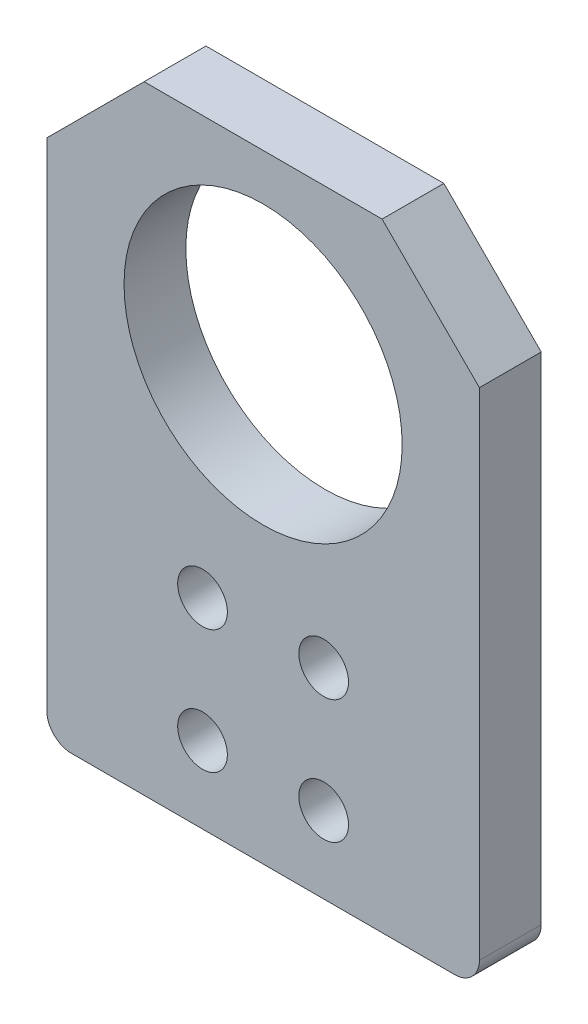
ISO-10303-21;
HEADER;
FILE_DESCRIPTION(('STEP AP214'),'2;1');
FILE_NAME('part.step','',(''),(''),'','','');
FILE_SCHEMA(('AUTOMOTIVE_DESIGN { 1 0 10303 214 1 1 1 1 }'));
ENDSEC;
DATA;
#1=APPLICATION_CONTEXT('core data for automotive mechanical design processes');
#2=APPLICATION_PROTOCOL_DEFINITION('international standard','automotive_design',2000,#1);
#3=PRODUCT_CONTEXT('',#1,'mechanical');
#4=PRODUCT('Part','Part','',(#3));
#5=PRODUCT_RELATED_PRODUCT_CATEGORY('part','',(#4));
#6=PRODUCT_DEFINITION_FORMATION('','',#4);
#7=PRODUCT_DEFINITION_CONTEXT('part definition',#1,'design');
#8=PRODUCT_DEFINITION('design','',#6,#7);
#9=PRODUCT_DEFINITION_SHAPE('','',#8);
#10=(LENGTH_UNIT() NAMED_UNIT(*) SI_UNIT(.MILLI.,.METRE.));
#11=(NAMED_UNIT(*) PLANE_ANGLE_UNIT() SI_UNIT($,.RADIAN.));
#12=(NAMED_UNIT(*) SI_UNIT($,.STERADIAN.) SOLID_ANGLE_UNIT());
#13=UNCERTAINTY_MEASURE_WITH_UNIT(LENGTH_MEASURE(1.E-05),#10,'distance_accuracy_value','');
#14=(GEOMETRIC_REPRESENTATION_CONTEXT(3) GLOBAL_UNCERTAINTY_ASSIGNED_CONTEXT((#13)) GLOBAL_UNIT_ASSIGNED_CONTEXT((#10,
#11,#12)) REPRESENTATION_CONTEXT('',''));
#15=CARTESIAN_POINT('',(0.,0.,0.));
#16=DIRECTION('',(0.,0.,1.));
#17=DIRECTION('',(1.,0.,0.));
#18=AXIS2_PLACEMENT_3D('',#15,#16,#17);
#19=CARTESIAN_POINT('',(22.225,-31.75,3.175));
#20=DIRECTION('',(-1.,0.,0.));
#21=DIRECTION('',(0.,0.,1.));
#22=AXIS2_PLACEMENT_3D('',#19,#20,#21);
#23=PLANE('',#22);
#24=DIRECTION('',(0.,1.,0.));
#25=VECTOR('',#24,1.);
#26=CARTESIAN_POINT('',(22.225,-31.75,3.175));
#27=LINE('',#26,#25);
#28=CARTESIAN_POINT('',(22.225,-29.21,3.175));
#29=VERTEX_POINT('',#28);
#30=CARTESIAN_POINT('',(22.225,21.75,3.175));
#31=VERTEX_POINT('',#30);
#32=EDGE_CURVE('E136',#29,#31,#27,.T.);
#33=ORIENTED_EDGE('',*,*,#32,.F.);
#34=DIRECTION('',(0.,0.,-1.));
#35=VECTOR('',#34,1.);
#36=CARTESIAN_POINT('',(22.225,-29.21,3.175));
#37=LINE('',#36,#35);
#38=CARTESIAN_POINT('',(22.225,-29.21,-3.175));
#39=VERTEX_POINT('',#38);
#40=EDGE_CURVE('E173',#29,#39,#37,.T.);
#41=ORIENTED_EDGE('',*,*,#40,.T.);
#42=DIRECTION('',(0.,1.,0.));
#43=VECTOR('',#42,1.);
#44=CARTESIAN_POINT('',(22.225,-31.75,-3.175));
#45=LINE('',#44,#43);
#46=CARTESIAN_POINT('',(22.225,21.75,-3.175));
#47=VERTEX_POINT('',#46);
#48=EDGE_CURVE('E133',#39,#47,#45,.T.);
#49=ORIENTED_EDGE('',*,*,#48,.T.);
#50=DIRECTION('',(0.,0.,1.));
#51=VECTOR('',#50,1.);
#52=CARTESIAN_POINT('',(22.225,21.75,3.175));
#53=LINE('',#52,#51);
#54=EDGE_CURVE('E163',#47,#31,#53,.T.);
#55=ORIENTED_EDGE('',*,*,#54,.T.);
#56=EDGE_LOOP('',(#33,#41,#49,#55));
#57=FACE_BOUND('',#56,.T.);
#58=ADVANCED_FACE('F35',(#57),#23,.F.);
#59=CARTESIAN_POINT('',(-22.225,31.75,3.175));
#60=DIRECTION('',(0.,-1.,0.));
#61=DIRECTION('',(0.,0.,-1.));
#62=AXIS2_PLACEMENT_3D('',#59,#60,#61);
#63=PLANE('',#62);
#64=DIRECTION('',(-1.,0.,0.));
#65=VECTOR('',#64,1.);
#66=CARTESIAN_POINT('',(-22.225,31.75,3.175));
#67=LINE('',#66,#65);
#68=CARTESIAN_POINT('',(12.225,31.75,3.175));
#69=VERTEX_POINT('',#68);
#70=CARTESIAN_POINT('',(-12.225,31.75,3.175));
#71=VERTEX_POINT('',#70);
#72=EDGE_CURVE('E138',#69,#71,#67,.T.);
#73=ORIENTED_EDGE('',*,*,#72,.F.);
#74=DIRECTION('',(0.,0.,-1.));
#75=VECTOR('',#74,1.);
#76=CARTESIAN_POINT('',(12.225,31.75,3.175));
#77=LINE('',#76,#75);
#78=CARTESIAN_POINT('',(12.225,31.75,-3.175));
#79=VERTEX_POINT('',#78);
#80=EDGE_CURVE('E155',#69,#79,#77,.T.);
#81=ORIENTED_EDGE('',*,*,#80,.T.);
#82=DIRECTION('',(-1.,0.,0.));
#83=VECTOR('',#82,1.);
#84=CARTESIAN_POINT('',(-22.225,31.75,-3.175));
#85=LINE('',#84,#83);
#86=CARTESIAN_POINT('',(-12.225,31.75,-3.175));
#87=VERTEX_POINT('',#86);
#88=EDGE_CURVE('E148',#79,#87,#85,.T.);
#89=ORIENTED_EDGE('',*,*,#88,.T.);
#90=DIRECTION('',(0.,0.,1.));
#91=VECTOR('',#90,1.);
#92=CARTESIAN_POINT('',(-12.225,31.75,3.175));
#93=LINE('',#92,#91);
#94=EDGE_CURVE('E146',#87,#71,#93,.T.);
#95=ORIENTED_EDGE('',*,*,#94,.T.);
#96=EDGE_LOOP('',(#73,#81,#89,#95));
#97=FACE_BOUND('',#96,.T.);
#98=ADVANCED_FACE('F225',(#97),#63,.F.);
#99=CARTESIAN_POINT('',(-22.225,-31.75,3.175));
#100=DIRECTION('',(1.,0.,0.));
#101=DIRECTION('',(0.,0.,-1.));
#102=AXIS2_PLACEMENT_3D('',#99,#100,#101);
#103=PLANE('',#102);
#104=DIRECTION('',(0.,-1.,0.));
#105=VECTOR('',#104,1.);
#106=CARTESIAN_POINT('',(-22.225,-31.75,-3.175));
#107=LINE('',#106,#105);
#108=CARTESIAN_POINT('',(-22.225,21.75,-3.175));
#109=VERTEX_POINT('',#108);
#110=CARTESIAN_POINT('',(-22.225,-29.21,-3.175));
#111=VERTEX_POINT('',#110);
#112=EDGE_CURVE('E151',#109,#111,#107,.T.);
#113=ORIENTED_EDGE('',*,*,#112,.T.);
#114=DIRECTION('',(0.,0.,-1.));
#115=VECTOR('',#114,1.);
#116=CARTESIAN_POINT('',(-22.225,-29.21,3.175));
#117=LINE('',#116,#115);
#118=CARTESIAN_POINT('',(-22.225,-29.21,3.175));
#119=VERTEX_POINT('',#118);
#120=EDGE_CURVE('E11',#111,#119,#117,.F.);
#121=ORIENTED_EDGE('',*,*,#120,.T.);
#122=DIRECTION('',(0.,-1.,0.));
#123=VECTOR('',#122,1.);
#124=CARTESIAN_POINT('',(-22.225,-31.75,3.175));
#125=LINE('',#124,#123);
#126=CARTESIAN_POINT('',(-22.225,21.75,3.175));
#127=VERTEX_POINT('',#126);
#128=EDGE_CURVE('E142',#127,#119,#125,.T.);
#129=ORIENTED_EDGE('',*,*,#128,.F.);
#130=DIRECTION('',(0.,0.,-1.));
#131=VECTOR('',#130,1.);
#132=CARTESIAN_POINT('',(-22.225,21.75,3.175));
#133=LINE('',#132,#131);
#134=EDGE_CURVE('E170',#127,#109,#133,.T.);
#135=ORIENTED_EDGE('',*,*,#134,.T.);
#136=EDGE_LOOP('',(#113,#121,#129,#135));
#137=FACE_BOUND('',#136,.T.);
#138=ADVANCED_FACE('F216',(#137),#103,.F.);
#139=CARTESIAN_POINT('',(-22.225,-31.75,3.175));
#140=DIRECTION('',(0.,1.,0.));
#141=DIRECTION('',(0.,0.,1.));
#142=AXIS2_PLACEMENT_3D('',#139,#140,#141);
#143=PLANE('',#142);
#144=CARTESIAN_POINT('',(-15.875,-31.75,0.));
#145=DIRECTION('',(0.,-1.,0.));
#146=DIRECTION('',(0.,0.,-1.));
#147=AXIS2_PLACEMENT_3D('',#144,#145,#146);
#148=CIRCLE('',#147,1.89864999999999);
#149=CARTESIAN_POINT('',(-15.875,-31.75,-1.89865));
#150=VERTEX_POINT('',#149);
#151=EDGE_CURVE('E117',#150,#150,#148,.T.);
#152=ORIENTED_EDGE('',*,*,#151,.F.);
#153=EDGE_LOOP('',(#152));
#154=FACE_BOUND('',#153,.T.);
#155=CARTESIAN_POINT('',(15.875,-31.75,0.));
#156=DIRECTION('',(0.,-1.,0.));
#157=DIRECTION('',(0.,0.,-1.));
#158=AXIS2_PLACEMENT_3D('',#155,#156,#157);
#159=CIRCLE('',#158,1.89864999999999);
#160=CARTESIAN_POINT('',(15.875,-31.75,-1.89864999999999));
#161=VERTEX_POINT('',#160);
#162=EDGE_CURVE('E116',#161,#161,#159,.T.);
#163=ORIENTED_EDGE('',*,*,#162,.F.);
#164=EDGE_LOOP('',(#163));
#165=FACE_BOUND('',#164,.T.);
#166=DIRECTION('',(1.,0.,0.));
#167=VECTOR('',#166,1.);
#168=CARTESIAN_POINT('',(-22.225,-31.75,-3.175));
#169=LINE('',#168,#167);
#170=CARTESIAN_POINT('',(-19.685,-31.75,-3.175));
#171=VERTEX_POINT('',#170);
#172=CARTESIAN_POINT('',(19.685,-31.75,-3.175));
#173=VERTEX_POINT('',#172);
#174=EDGE_CURVE('E139',#171,#173,#169,.T.);
#175=ORIENTED_EDGE('',*,*,#174,.T.);
#176=DIRECTION('',(0.,0.,-1.));
#177=VECTOR('',#176,1.);
#178=CARTESIAN_POINT('',(19.685,-31.75,3.175));
#179=LINE('',#178,#177);
#180=CARTESIAN_POINT('',(19.685,-31.75,3.175));
#181=VERTEX_POINT('',#180);
#182=EDGE_CURVE('E56',#173,#181,#179,.F.);
#183=ORIENTED_EDGE('',*,*,#182,.T.);
#184=DIRECTION('',(1.,0.,0.));
#185=VECTOR('',#184,1.);
#186=CARTESIAN_POINT('',(-22.225,-31.75,3.175));
#187=LINE('',#186,#185);
#188=CARTESIAN_POINT('',(-19.685,-31.75,3.175));
#189=VERTEX_POINT('',#188);
#190=EDGE_CURVE('E144',#189,#181,#187,.T.);
#191=ORIENTED_EDGE('',*,*,#190,.F.);
#192=DIRECTION('',(0.,0.,-1.));
#193=VECTOR('',#192,1.);
#194=CARTESIAN_POINT('',(-19.685,-31.75,3.175));
#195=LINE('',#194,#193);
#196=EDGE_CURVE('E192',#189,#171,#195,.T.);
#197=ORIENTED_EDGE('',*,*,#196,.T.);
#198=EDGE_LOOP('',(#175,#183,#191,#197));
#199=FACE_BOUND('',#198,.T.);
#200=ADVANCED_FACE('F211',(#154,#165,#199),#143,.F.);
#201=CARTESIAN_POINT('',(0.,0.,3.175));
#202=DIRECTION('',(0.,0.,-1.));
#203=DIRECTION('',(-1.,0.,0.));
#204=AXIS2_PLACEMENT_3D('',#201,#202,#203);
#205=PLANE('',#204);
#206=CARTESIAN_POINT('',(-6.223,-11.176,3.175));
#207=DIRECTION('',(0.,0.,1.));
#208=DIRECTION('',(1.,0.,0.));
#209=AXIS2_PLACEMENT_3D('',#206,#207,#208);
#210=CIRCLE('',#209,2.55269999999999);
#211=CARTESIAN_POINT('',(-3.67030000000001,-11.176,3.175));
#212=VERTEX_POINT('',#211);
#213=EDGE_CURVE('E185',#212,#212,#210,.T.);
#214=ORIENTED_EDGE('',*,*,#213,.F.);
#215=EDGE_LOOP('',(#214));
#216=FACE_BOUND('',#215,.T.);
#217=CARTESIAN_POINT('',(6.223,-11.176,3.175));
#218=DIRECTION('',(0.,0.,1.));
#219=DIRECTION('',(1.,0.,0.));
#220=AXIS2_PLACEMENT_3D('',#217,#218,#219);
#221=CIRCLE('',#220,2.55269999999999);
#222=CARTESIAN_POINT('',(8.77569999999999,-11.176,3.175));
#223=VERTEX_POINT('',#222);
#224=EDGE_CURVE('E181',#223,#223,#221,.T.);
#225=ORIENTED_EDGE('',*,*,#224,.F.);
#226=EDGE_LOOP('',(#225));
#227=FACE_BOUND('',#226,.T.);
#228=CARTESIAN_POINT('',(6.223,-23.876,3.175));
#229=DIRECTION('',(0.,0.,1.));
#230=DIRECTION('',(1.,0.,0.));
#231=AXIS2_PLACEMENT_3D('',#228,#229,#230);
#232=CIRCLE('',#231,2.55269999999999);
#233=CARTESIAN_POINT('',(8.77569999999999,-23.876,3.175));
#234=VERTEX_POINT('',#233);
#235=EDGE_CURVE('E180',#234,#234,#232,.T.);
#236=ORIENTED_EDGE('',*,*,#235,.F.);
#237=EDGE_LOOP('',(#236));
#238=FACE_BOUND('',#237,.T.);
#239=CARTESIAN_POINT('',(-6.223,-23.876,3.175));
#240=DIRECTION('',(0.,0.,1.));
#241=DIRECTION('',(1.,0.,0.));
#242=AXIS2_PLACEMENT_3D('',#239,#240,#241);
#243=CIRCLE('',#242,2.55269999999999);
#244=CARTESIAN_POINT('',(-3.67030000000001,-23.876,3.175));
#245=VERTEX_POINT('',#244);
#246=EDGE_CURVE('E176',#245,#245,#243,.T.);
#247=ORIENTED_EDGE('',*,*,#246,.F.);
#248=EDGE_LOOP('',(#247));
#249=FACE_BOUND('',#248,.T.);
#250=CARTESIAN_POINT('',(0.,12.7,3.175));
#251=DIRECTION('',(0.,0.,1.));
#252=DIRECTION('',(1.,0.,0.));
#253=AXIS2_PLACEMENT_3D('',#250,#251,#252);
#254=CIRCLE('',#253,14.2875);
#255=CARTESIAN_POINT('',(14.2875,12.7,3.175));
#256=VERTEX_POINT('',#255);
#257=EDGE_CURVE('E129',#256,#256,#254,.T.);
#258=ORIENTED_EDGE('',*,*,#257,.F.);
#259=EDGE_LOOP('',(#258));
#260=FACE_BOUND('',#259,.T.);
#261=ORIENTED_EDGE('',*,*,#190,.T.);
#262=CARTESIAN_POINT('',(19.685,-29.21,3.175));
#263=DIRECTION('',(0.,0.,-1.));
#264=DIRECTION('',(-1.,0.,0.));
#265=AXIS2_PLACEMENT_3D('',#262,#263,#264);
#266=CIRCLE('',#265,2.54);
#267=EDGE_CURVE('E43',#181,#29,#266,.F.);
#268=ORIENTED_EDGE('',*,*,#267,.T.);
#269=ORIENTED_EDGE('',*,*,#32,.T.);
#270=DIRECTION('',(0.707106781186546,-0.707106781186549,0.));
#271=VECTOR('',#270,1.);
#272=CARTESIAN_POINT('',(12.225,31.75,3.175));
#273=LINE('',#272,#271);
#274=EDGE_CURVE('E168',#31,#69,#273,.F.);
#275=ORIENTED_EDGE('',*,*,#274,.T.);
#276=ORIENTED_EDGE('',*,*,#72,.T.);
#277=DIRECTION('',(0.707106781186549,0.707106781186546,0.));
#278=VECTOR('',#277,1.);
#279=CARTESIAN_POINT('',(-22.225,21.75,3.175));
#280=LINE('',#279,#278);
#281=EDGE_CURVE('E166',#71,#127,#280,.F.);
#282=ORIENTED_EDGE('',*,*,#281,.T.);
#283=ORIENTED_EDGE('',*,*,#128,.T.);
#284=CARTESIAN_POINT('',(-19.685,-29.21,3.175));
#285=DIRECTION('',(0.,0.,-1.));
#286=DIRECTION('',(-1.,0.,0.));
#287=AXIS2_PLACEMENT_3D('',#284,#285,#286);
#288=CIRCLE('',#287,2.54);
#289=EDGE_CURVE('E196',#119,#189,#288,.F.);
#290=ORIENTED_EDGE('',*,*,#289,.T.);
#291=EDGE_LOOP('',(#261,#268,#269,#275,#276,#282,#283,#290));
#292=FACE_BOUND('',#291,.T.);
#293=ADVANCED_FACE('F200',(#216,#227,#238,#249,#260,#292),#205,.F.);
#294=CARTESIAN_POINT('',(0.,0.,-3.175));
#295=DIRECTION('',(0.,0.,-1.));
#296=DIRECTION('',(-1.,0.,0.));
#297=AXIS2_PLACEMENT_3D('',#294,#295,#296);
#298=PLANE('',#297);
#299=CARTESIAN_POINT('',(-6.223,-11.176,-3.175));
#300=DIRECTION('',(0.,0.,-1.));
#301=DIRECTION('',(-1.,0.,0.));
#302=AXIS2_PLACEMENT_3D('',#299,#300,#301);
#303=CIRCLE('',#302,2.55269999999999);
#304=CARTESIAN_POINT('',(-8.77569999999999,-11.176,-3.175));
#305=VERTEX_POINT('',#304);
#306=EDGE_CURVE('E182',#305,#305,#303,.T.);
#307=ORIENTED_EDGE('',*,*,#306,.F.);
#308=EDGE_LOOP('',(#307));
#309=FACE_BOUND('',#308,.T.);
#310=CARTESIAN_POINT('',(6.223,-11.176,-3.175));
#311=DIRECTION('',(0.,0.,-1.));
#312=DIRECTION('',(-1.,0.,0.));
#313=AXIS2_PLACEMENT_3D('',#310,#311,#312);
#314=CIRCLE('',#313,2.55269999999999);
#315=CARTESIAN_POINT('',(3.67030000000001,-11.176,-3.175));
#316=VERTEX_POINT('',#315);
#317=EDGE_CURVE('E177',#316,#316,#314,.T.);
#318=ORIENTED_EDGE('',*,*,#317,.F.);
#319=EDGE_LOOP('',(#318));
#320=FACE_BOUND('',#319,.T.);
#321=CARTESIAN_POINT('',(6.223,-23.876,-3.175));
#322=DIRECTION('',(0.,0.,-1.));
#323=DIRECTION('',(-1.,0.,0.));
#324=AXIS2_PLACEMENT_3D('',#321,#322,#323);
#325=CIRCLE('',#324,2.55269999999999);
#326=CARTESIAN_POINT('',(3.67030000000001,-23.876,-3.175));
#327=VERTEX_POINT('',#326);
#328=EDGE_CURVE('E296',#327,#327,#325,.T.);
#329=ORIENTED_EDGE('',*,*,#328,.F.);
#330=EDGE_LOOP('',(#329));
#331=FACE_BOUND('',#330,.T.);
#332=CARTESIAN_POINT('',(-6.223,-23.876,-3.175));
#333=DIRECTION('',(0.,0.,-1.));
#334=DIRECTION('',(-1.,0.,0.));
#335=AXIS2_PLACEMENT_3D('',#332,#333,#334);
#336=CIRCLE('',#335,2.55269999999999);
#337=CARTESIAN_POINT('',(-8.77569999999999,-23.876,-3.175));
#338=VERTEX_POINT('',#337);
#339=EDGE_CURVE('E123',#338,#338,#336,.T.);
#340=ORIENTED_EDGE('',*,*,#339,.F.);
#341=EDGE_LOOP('',(#340));
#342=FACE_BOUND('',#341,.T.);
#343=CARTESIAN_POINT('',(0.,12.7,-3.175));
#344=DIRECTION('',(0.,0.,1.));
#345=DIRECTION('',(1.,0.,0.));
#346=AXIS2_PLACEMENT_3D('',#343,#344,#345);
#347=CIRCLE('',#346,14.2875);
#348=CARTESIAN_POINT('',(14.2875,12.7,-3.175));
#349=VERTEX_POINT('',#348);
#350=EDGE_CURVE('E130',#349,#349,#347,.T.);
#351=ORIENTED_EDGE('',*,*,#350,.T.);
#352=EDGE_LOOP('',(#351));
#353=FACE_BOUND('',#352,.T.);
#354=ORIENTED_EDGE('',*,*,#48,.F.);
#355=CARTESIAN_POINT('',(19.685,-29.21,-3.175));
#356=DIRECTION('',(0.,0.,-1.));
#357=DIRECTION('',(-1.,0.,0.));
#358=AXIS2_PLACEMENT_3D('',#355,#356,#357);
#359=CIRCLE('',#358,2.54);
#360=EDGE_CURVE('E190',#39,#173,#359,.T.);
#361=ORIENTED_EDGE('',*,*,#360,.T.);
#362=ORIENTED_EDGE('',*,*,#174,.F.);
#363=CARTESIAN_POINT('',(-19.685,-29.21,-3.175));
#364=DIRECTION('',(0.,0.,-1.));
#365=DIRECTION('',(-1.,0.,0.));
#366=AXIS2_PLACEMENT_3D('',#363,#364,#365);
#367=CIRCLE('',#366,2.54);
#368=EDGE_CURVE('E188',#171,#111,#367,.T.);
#369=ORIENTED_EDGE('',*,*,#368,.T.);
#370=ORIENTED_EDGE('',*,*,#112,.F.);
#371=DIRECTION('',(-0.707106781186549,-0.707106781186546,0.));
#372=VECTOR('',#371,1.);
#373=CARTESIAN_POINT('',(-21.9875,21.9875000000001,-3.175));
#374=LINE('',#373,#372);
#375=EDGE_CURVE('E158',#109,#87,#374,.F.);
#376=ORIENTED_EDGE('',*,*,#375,.T.);
#377=ORIENTED_EDGE('',*,*,#88,.F.);
#378=DIRECTION('',(-0.707106781186546,0.707106781186549,0.));
#379=VECTOR('',#378,1.);
#380=CARTESIAN_POINT('',(21.9875,21.9875,-3.175));
#381=LINE('',#380,#379);
#382=EDGE_CURVE('E160',#79,#47,#381,.F.);
#383=ORIENTED_EDGE('',*,*,#382,.T.);
#384=EDGE_LOOP('',(#354,#361,#362,#369,#370,#376,#377,#383));
#385=FACE_BOUND('',#384,.T.);
#386=ADVANCED_FACE('F210',(#309,#320,#331,#342,#353,#385),#298,.T.);
#387=CARTESIAN_POINT('',(12.225,31.75,3.175));
#388=DIRECTION('',(-0.707106781186549,-0.707106781186546,0.));
#389=DIRECTION('',(0.,0.,-1.));
#390=AXIS2_PLACEMENT_3D('',#387,#388,#389);
#391=PLANE('',#390);
#392=ORIENTED_EDGE('',*,*,#274,.F.);
#393=ORIENTED_EDGE('',*,*,#54,.F.);
#394=ORIENTED_EDGE('',*,*,#382,.F.);
#395=ORIENTED_EDGE('',*,*,#80,.F.);
#396=EDGE_LOOP('',(#392,#393,#394,#395));
#397=FACE_BOUND('',#396,.T.);
#398=ADVANCED_FACE('F228',(#397),#391,.F.);
#399=CARTESIAN_POINT('',(-22.225,21.75,3.175));
#400=DIRECTION('',(0.707106781186546,-0.707106781186549,0.));
#401=DIRECTION('',(0.,0.,-1.));
#402=AXIS2_PLACEMENT_3D('',#399,#400,#401);
#403=PLANE('',#402);
#404=ORIENTED_EDGE('',*,*,#281,.F.);
#405=ORIENTED_EDGE('',*,*,#94,.F.);
#406=ORIENTED_EDGE('',*,*,#375,.F.);
#407=ORIENTED_EDGE('',*,*,#134,.F.);
#408=EDGE_LOOP('',(#404,#405,#406,#407));
#409=FACE_BOUND('',#408,.T.);
#410=ADVANCED_FACE('F220',(#409),#403,.F.);
#411=CARTESIAN_POINT('',(0.,12.7,-3.175));
#412=DIRECTION('',(0.,0.,1.));
#413=DIRECTION('',(1.,0.,0.));
#414=AXIS2_PLACEMENT_3D('',#411,#412,#413);
#415=CYLINDRICAL_SURFACE('',#414,14.2875);
#416=ORIENTED_EDGE('',*,*,#350,.F.);
#417=EDGE_LOOP('',(#416));
#418=FACE_BOUND('',#417,.T.);
#419=ORIENTED_EDGE('',*,*,#257,.T.);
#420=EDGE_LOOP('',(#419));
#421=FACE_BOUND('',#420,.T.);
#422=ADVANCED_FACE('F235',(#418,#421),#415,.F.);
#423=CARTESIAN_POINT('',(15.875,-12.7,0.));
#424=DIRECTION('',(0.,-1.,0.));
#425=DIRECTION('',(0.,0.,-1.));
#426=AXIS2_PLACEMENT_3D('',#423,#424,#425);
#427=CONICAL_SURFACE('',#426,1.89864999999999,1.02974425867665);
#428=CARTESIAN_POINT('',(15.875,-11.5591759856833,0.));
#429=VERTEX_POINT('',#428);
#430=VERTEX_LOOP('',#429);
#431=FACE_BOUND('',#430,.T.);
#432=CARTESIAN_POINT('',(15.875,-12.7,0.));
#433=DIRECTION('',(0.,-1.,0.));
#434=DIRECTION('',(0.,0.,-1.));
#435=AXIS2_PLACEMENT_3D('',#432,#433,#434);
#436=CIRCLE('',#435,1.89864999999999);
#437=CARTESIAN_POINT('',(15.875,-12.7,-1.89864999999999));
#438=VERTEX_POINT('',#437);
#439=EDGE_CURVE('E120',#438,#438,#436,.T.);
#440=ORIENTED_EDGE('',*,*,#439,.T.);
#441=EDGE_LOOP('',(#440));
#442=FACE_BOUND('',#441,.T.);
#443=ADVANCED_FACE('F259',(#431,#442),#427,.F.);
#444=CARTESIAN_POINT('',(15.875,-31.75,0.));
#445=DIRECTION('',(0.,-1.,0.));
#446=DIRECTION('',(0.,0.,-1.));
#447=AXIS2_PLACEMENT_3D('',#444,#445,#446);
#448=CYLINDRICAL_SURFACE('',#447,1.89864999999999);
#449=ORIENTED_EDGE('',*,*,#439,.F.);
#450=EDGE_LOOP('',(#449));
#451=FACE_BOUND('',#450,.T.);
#452=ORIENTED_EDGE('',*,*,#162,.T.);
#453=EDGE_LOOP('',(#452));
#454=FACE_BOUND('',#453,.T.);
#455=ADVANCED_FACE('F110',(#451,#454),#448,.F.);
#456=CARTESIAN_POINT('',(-15.875,-12.7,0.));
#457=DIRECTION('',(0.,-1.,0.));
#458=DIRECTION('',(0.,0.,-1.));
#459=AXIS2_PLACEMENT_3D('',#456,#457,#458);
#460=CONICAL_SURFACE('',#459,1.89864999999999,1.02974425867665);
#461=CARTESIAN_POINT('',(-15.875,-11.5591759856833,0.));
#462=VERTEX_POINT('',#461);
#463=VERTEX_LOOP('',#462);
#464=FACE_BOUND('',#463,.T.);
#465=CARTESIAN_POINT('',(-15.875,-12.7,0.));
#466=DIRECTION('',(0.,-1.,0.));
#467=DIRECTION('',(0.,0.,-1.));
#468=AXIS2_PLACEMENT_3D('',#465,#466,#467);
#469=CIRCLE('',#468,1.89864999999999);
#470=CARTESIAN_POINT('',(-15.875,-12.7,-1.89865));
#471=VERTEX_POINT('',#470);
#472=EDGE_CURVE('E114',#471,#471,#469,.T.);
#473=ORIENTED_EDGE('',*,*,#472,.T.);
#474=EDGE_LOOP('',(#473));
#475=FACE_BOUND('',#474,.T.);
#476=ADVANCED_FACE('F106',(#464,#475),#460,.F.);
#477=CARTESIAN_POINT('',(-15.875,-31.75,0.));
#478=DIRECTION('',(0.,-1.,0.));
#479=DIRECTION('',(0.,0.,-1.));
#480=AXIS2_PLACEMENT_3D('',#477,#478,#479);
#481=CYLINDRICAL_SURFACE('',#480,1.89864999999999);
#482=ORIENTED_EDGE('',*,*,#472,.F.);
#483=EDGE_LOOP('',(#482));
#484=FACE_BOUND('',#483,.T.);
#485=ORIENTED_EDGE('',*,*,#151,.T.);
#486=EDGE_LOOP('',(#485));
#487=FACE_BOUND('',#486,.T.);
#488=ADVANCED_FACE('F109',(#484,#487),#481,.F.);
#489=CARTESIAN_POINT('',(-6.223,-23.876,3.175));
#490=DIRECTION('',(0.,0.,1.));
#491=DIRECTION('',(1.,0.,0.));
#492=AXIS2_PLACEMENT_3D('',#489,#490,#491);
#493=CYLINDRICAL_SURFACE('',#492,2.55269999999999);
#494=ORIENTED_EDGE('',*,*,#339,.T.);
#495=EDGE_LOOP('',(#494));
#496=FACE_BOUND('',#495,.T.);
#497=ORIENTED_EDGE('',*,*,#246,.T.);
#498=EDGE_LOOP('',(#497));
#499=FACE_BOUND('',#498,.T.);
#500=ADVANCED_FACE('F269',(#496,#499),#493,.F.);
#501=CARTESIAN_POINT('',(6.223,-23.876,3.175));
#502=DIRECTION('',(0.,0.,1.));
#503=DIRECTION('',(1.,0.,0.));
#504=AXIS2_PLACEMENT_3D('',#501,#502,#503);
#505=CYLINDRICAL_SURFACE('',#504,2.55269999999999);
#506=ORIENTED_EDGE('',*,*,#328,.T.);
#507=EDGE_LOOP('',(#506));
#508=FACE_BOUND('',#507,.T.);
#509=ORIENTED_EDGE('',*,*,#235,.T.);
#510=EDGE_LOOP('',(#509));
#511=FACE_BOUND('',#510,.T.);
#512=ADVANCED_FACE('F272',(#508,#511),#505,.F.);
#513=CARTESIAN_POINT('',(6.223,-11.176,3.175));
#514=DIRECTION('',(0.,0.,1.));
#515=DIRECTION('',(1.,0.,0.));
#516=AXIS2_PLACEMENT_3D('',#513,#514,#515);
#517=CYLINDRICAL_SURFACE('',#516,2.55269999999999);
#518=ORIENTED_EDGE('',*,*,#317,.T.);
#519=EDGE_LOOP('',(#518));
#520=FACE_BOUND('',#519,.T.);
#521=ORIENTED_EDGE('',*,*,#224,.T.);
#522=EDGE_LOOP('',(#521));
#523=FACE_BOUND('',#522,.T.);
#524=ADVANCED_FACE('F276',(#520,#523),#517,.F.);
#525=CARTESIAN_POINT('',(-6.223,-11.176,3.175));
#526=DIRECTION('',(0.,0.,1.));
#527=DIRECTION('',(1.,0.,0.));
#528=AXIS2_PLACEMENT_3D('',#525,#526,#527);
#529=CYLINDRICAL_SURFACE('',#528,2.55269999999999);
#530=ORIENTED_EDGE('',*,*,#306,.T.);
#531=EDGE_LOOP('',(#530));
#532=FACE_BOUND('',#531,.T.);
#533=ORIENTED_EDGE('',*,*,#213,.T.);
#534=EDGE_LOOP('',(#533));
#535=FACE_BOUND('',#534,.T.);
#536=ADVANCED_FACE('F280',(#532,#535),#529,.F.);
#537=CARTESIAN_POINT('',(19.685,-29.21,3.175));
#538=DIRECTION('',(0.,0.,-1.));
#539=DIRECTION('',(-1.,0.,0.));
#540=AXIS2_PLACEMENT_3D('',#537,#538,#539);
#541=CYLINDRICAL_SURFACE('',#540,2.54);
#542=ORIENTED_EDGE('',*,*,#267,.F.);
#543=ORIENTED_EDGE('',*,*,#182,.F.);
#544=ORIENTED_EDGE('',*,*,#360,.F.);
#545=ORIENTED_EDGE('',*,*,#40,.F.);
#546=EDGE_LOOP('',(#542,#543,#544,#545));
#547=FACE_BOUND('',#546,.T.);
#548=ADVANCED_FACE('F207',(#547),#541,.T.);
#549=CARTESIAN_POINT('',(-19.685,-29.21,3.175));
#550=DIRECTION('',(0.,0.,-1.));
#551=DIRECTION('',(-1.,0.,0.));
#552=AXIS2_PLACEMENT_3D('',#549,#550,#551);
#553=CYLINDRICAL_SURFACE('',#552,2.54);
#554=ORIENTED_EDGE('',*,*,#289,.F.);
#555=ORIENTED_EDGE('',*,*,#120,.F.);
#556=ORIENTED_EDGE('',*,*,#368,.F.);
#557=ORIENTED_EDGE('',*,*,#196,.F.);
#558=EDGE_LOOP('',(#554,#555,#556,#557));
#559=FACE_BOUND('',#558,.T.);
#560=ADVANCED_FACE('F37',(#559),#553,.T.);
#561=CLOSED_SHELL('',(#58,#98,#138,#200,#293,#386,#398,#410,#422,#443,#455,#476,#488,#500,#512,
#524,#536,#548,#560));
#562=MANIFOLD_SOLID_BREP('B2',#561);
#563=ADVANCED_BREP_SHAPE_REPRESENTATION('',(#18,#562),#14);
#564=SHAPE_DEFINITION_REPRESENTATION(#9,#563);
ENDSEC;
END-ISO-10303-21;
